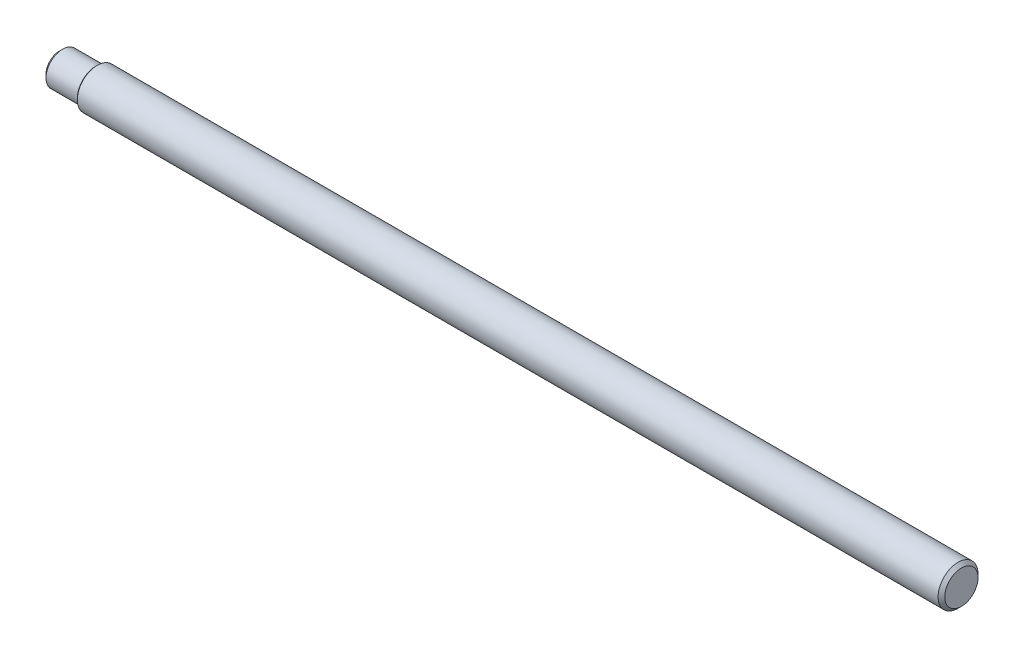
ISO-10303-21;
HEADER;
FILE_DESCRIPTION(('STEP AP214'),'2;1');
FILE_NAME('part.step','',(''),(''),'','','');
FILE_SCHEMA(('AUTOMOTIVE_DESIGN { 1 0 10303 214 1 1 1 1 }'));
ENDSEC;
DATA;
#1=APPLICATION_CONTEXT('core data for automotive mechanical design processes');
#2=APPLICATION_PROTOCOL_DEFINITION('international standard','automotive_design',2000,#1);
#3=PRODUCT_CONTEXT('',#1,'mechanical');
#4=PRODUCT('Part','Part','',(#3));
#5=PRODUCT_RELATED_PRODUCT_CATEGORY('part','',(#4));
#6=PRODUCT_DEFINITION_FORMATION('','',#4);
#7=PRODUCT_DEFINITION_CONTEXT('part definition',#1,'design');
#8=PRODUCT_DEFINITION('design','',#6,#7);
#9=PRODUCT_DEFINITION_SHAPE('','',#8);
#10=(LENGTH_UNIT() NAMED_UNIT(*) SI_UNIT(.MILLI.,.METRE.));
#11=(NAMED_UNIT(*) PLANE_ANGLE_UNIT() SI_UNIT($,.RADIAN.));
#12=(NAMED_UNIT(*) SI_UNIT($,.STERADIAN.) SOLID_ANGLE_UNIT());
#13=UNCERTAINTY_MEASURE_WITH_UNIT(LENGTH_MEASURE(1.E-05),#10,'distance_accuracy_value','');
#14=(GEOMETRIC_REPRESENTATION_CONTEXT(3) GLOBAL_UNCERTAINTY_ASSIGNED_CONTEXT((#13)) GLOBAL_UNIT_ASSIGNED_CONTEXT((#10,
#11,#12)) REPRESENTATION_CONTEXT('',''));
#15=CARTESIAN_POINT('',(0.,0.,0.));
#16=DIRECTION('',(0.,0.,1.));
#17=DIRECTION('',(1.,0.,0.));
#18=AXIS2_PLACEMENT_3D('',#15,#16,#17);
#19=CARTESIAN_POINT('',(130.,2.5,0.));
#20=DIRECTION('',(-1.,0.,0.));
#21=DIRECTION('',(0.,0.,1.));
#22=AXIS2_PLACEMENT_3D('',#19,#20,#21);
#23=PLANE('',#22);
#24=CARTESIAN_POINT('',(130.,0.,0.));
#25=DIRECTION('',(-1.,0.,0.));
#26=DIRECTION('',(0.,0.,1.));
#27=AXIS2_PLACEMENT_3D('',#24,#25,#26);
#28=CIRCLE('',#27,2.5);
#29=CARTESIAN_POINT('',(130.,0.,2.5));
#30=VERTEX_POINT('',#29);
#31=EDGE_CURVE('E10',#30,#30,#28,.T.);
#32=ORIENTED_EDGE('',*,*,#31,.F.);
#33=EDGE_LOOP('',(#32));
#34=FACE_BOUND('',#33,.T.);
#35=ADVANCED_FACE('F32',(#34),#23,.F.);
#36=CARTESIAN_POINT('',(130.,0.,0.));
#37=DIRECTION('',(-1.,0.,0.));
#38=DIRECTION('',(0.,0.,1.));
#39=AXIS2_PLACEMENT_3D('',#36,#37,#38);
#40=CONICAL_SURFACE('',#39,2.5,0.785398163397448);
#41=CARTESIAN_POINT('',(129.5,0.,0.));
#42=DIRECTION('',(-1.,0.,0.));
#43=DIRECTION('',(0.,0.,1.));
#44=AXIS2_PLACEMENT_3D('',#41,#42,#43);
#45=CIRCLE('',#44,3.);
#46=CARTESIAN_POINT('',(129.5,0.,3.));
#47=VERTEX_POINT('',#46);
#48=EDGE_CURVE('E38',#47,#47,#45,.T.);
#49=ORIENTED_EDGE('',*,*,#48,.F.);
#50=EDGE_LOOP('',(#49));
#51=FACE_BOUND('',#50,.T.);
#52=ORIENTED_EDGE('',*,*,#31,.T.);
#53=EDGE_LOOP('',(#52));
#54=FACE_BOUND('',#53,.T.);
#55=ADVANCED_FACE('F98',(#51,#54),#40,.T.);
#56=CARTESIAN_POINT('',(130.,0.,0.));
#57=DIRECTION('',(-1.,0.,0.));
#58=DIRECTION('',(0.,0.,1.));
#59=AXIS2_PLACEMENT_3D('',#56,#57,#58);
#60=CYLINDRICAL_SURFACE('',#59,3.);
#61=CARTESIAN_POINT('',(0.200000000000006,0.,0.));
#62=DIRECTION('',(-1.,0.,0.));
#63=DIRECTION('',(0.,0.,1.));
#64=AXIS2_PLACEMENT_3D('',#61,#62,#63);
#65=CIRCLE('',#64,3.);
#66=CARTESIAN_POINT('',(0.200000000000006,0.,3.));
#67=VERTEX_POINT('',#66);
#68=EDGE_CURVE('E42',#67,#67,#65,.T.);
#69=ORIENTED_EDGE('',*,*,#68,.F.);
#70=EDGE_LOOP('',(#69));
#71=FACE_BOUND('',#70,.T.);
#72=ORIENTED_EDGE('',*,*,#48,.T.);
#73=EDGE_LOOP('',(#72));
#74=FACE_BOUND('',#73,.T.);
#75=ADVANCED_FACE('F93',(#71,#74),#60,.T.);
#76=CARTESIAN_POINT('',(0.200000000000006,0.,0.));
#77=DIRECTION('',(1.,0.,0.));
#78=DIRECTION('',(0.,0.,-1.));
#79=AXIS2_PLACEMENT_3D('',#76,#77,#78);
#80=CONICAL_SURFACE('',#79,3.,0.785398163397434);
#81=CARTESIAN_POINT('',(0.,0.,0.));
#82=DIRECTION('',(-1.,0.,0.));
#83=DIRECTION('',(0.,0.,1.));
#84=AXIS2_PLACEMENT_3D('',#81,#82,#83);
#85=CIRCLE('',#84,2.8);
#86=CARTESIAN_POINT('',(0.,0.,2.8));
#87=VERTEX_POINT('',#86);
#88=EDGE_CURVE('E46',#87,#87,#85,.T.);
#89=ORIENTED_EDGE('',*,*,#88,.F.);
#90=EDGE_LOOP('',(#89));
#91=FACE_BOUND('',#90,.T.);
#92=ORIENTED_EDGE('',*,*,#68,.T.);
#93=EDGE_LOOP('',(#92));
#94=FACE_BOUND('',#93,.T.);
#95=ADVANCED_FACE('F87',(#91,#94),#80,.T.);
#96=CARTESIAN_POINT('',(0.,2.7,0.));
#97=DIRECTION('',(1.,0.,0.));
#98=DIRECTION('',(0.,0.,-1.));
#99=AXIS2_PLACEMENT_3D('',#96,#97,#98);
#100=PLANE('',#99);
#101=CARTESIAN_POINT('',(0.,0.,0.));
#102=DIRECTION('',(-1.,0.,0.));
#103=DIRECTION('',(0.,0.,1.));
#104=AXIS2_PLACEMENT_3D('',#101,#102,#103);
#105=CIRCLE('',#104,2.7);
#106=CARTESIAN_POINT('',(0.,0.,2.7));
#107=VERTEX_POINT('',#106);
#108=EDGE_CURVE('E51',#107,#107,#105,.T.);
#109=ORIENTED_EDGE('',*,*,#108,.F.);
#110=EDGE_LOOP('',(#109));
#111=FACE_BOUND('',#110,.T.);
#112=ORIENTED_EDGE('',*,*,#88,.T.);
#113=EDGE_LOOP('',(#112));
#114=FACE_BOUND('',#113,.T.);
#115=ADVANCED_FACE('F81',(#111,#114),#100,.F.);
#116=CARTESIAN_POINT('',(-0.200000000000017,0.,0.));
#117=DIRECTION('',(-1.,0.,0.));
#118=DIRECTION('',(0.,0.,1.));
#119=AXIS2_PLACEMENT_3D('',#116,#117,#118);
#120=TOROIDAL_SURFACE('',#119,2.70000000000002,0.200000000000017);
#121=CARTESIAN_POINT('',(-0.200000000000006,0.,0.));
#122=DIRECTION('',(-1.,0.,0.));
#123=DIRECTION('',(0.,0.,1.));
#124=AXIS2_PLACEMENT_3D('',#121,#122,#123);
#125=CIRCLE('',#124,2.5);
#126=CARTESIAN_POINT('',(-0.200000000000006,0.,2.5));
#127=VERTEX_POINT('',#126);
#128=EDGE_CURVE('E54',#127,#127,#125,.T.);
#129=ORIENTED_EDGE('',*,*,#128,.F.);
#130=EDGE_LOOP('',(#129));
#131=FACE_BOUND('',#130,.T.);
#132=ORIENTED_EDGE('',*,*,#108,.T.);
#133=EDGE_LOOP('',(#132));
#134=FACE_BOUND('',#133,.T.);
#135=ADVANCED_FACE('F75',(#131,#134),#120,.F.);
#136=CARTESIAN_POINT('',(130.,0.,0.));
#137=DIRECTION('',(-1.,0.,0.));
#138=DIRECTION('',(0.,0.,1.));
#139=AXIS2_PLACEMENT_3D('',#136,#137,#138);
#140=CYLINDRICAL_SURFACE('',#139,2.5);
#141=CARTESIAN_POINT('',(-5.,0.,0.));
#142=DIRECTION('',(-1.,0.,0.));
#143=DIRECTION('',(0.,0.,1.));
#144=AXIS2_PLACEMENT_3D('',#141,#142,#143);
#145=CIRCLE('',#144,2.5);
#146=CARTESIAN_POINT('',(-5.,0.,2.5));
#147=VERTEX_POINT('',#146);
#148=EDGE_CURVE('E57',#147,#147,#145,.T.);
#149=ORIENTED_EDGE('',*,*,#148,.F.);
#150=EDGE_LOOP('',(#149));
#151=FACE_BOUND('',#150,.T.);
#152=ORIENTED_EDGE('',*,*,#128,.T.);
#153=EDGE_LOOP('',(#152));
#154=FACE_BOUND('',#153,.T.);
#155=ADVANCED_FACE('F69',(#151,#154),#140,.T.);
#156=CARTESIAN_POINT('',(-5.,0.,0.));
#157=DIRECTION('',(1.,0.,0.));
#158=DIRECTION('',(0.,0.,-1.));
#159=AXIS2_PLACEMENT_3D('',#156,#157,#158);
#160=CONICAL_SURFACE('',#159,2.5,0.785398163397448);
#161=CARTESIAN_POINT('',(-5.50000000000001,0.,0.));
#162=DIRECTION('',(-1.,0.,0.));
#163=DIRECTION('',(0.,0.,1.));
#164=AXIS2_PLACEMENT_3D('',#161,#162,#163);
#165=CIRCLE('',#164,2.);
#166=CARTESIAN_POINT('',(-5.50000000000001,0.,2.));
#167=VERTEX_POINT('',#166);
#168=EDGE_CURVE('E60',#167,#167,#165,.T.);
#169=ORIENTED_EDGE('',*,*,#168,.F.);
#170=EDGE_LOOP('',(#169));
#171=FACE_BOUND('',#170,.T.);
#172=ORIENTED_EDGE('',*,*,#148,.T.);
#173=EDGE_LOOP('',(#172));
#174=FACE_BOUND('',#173,.T.);
#175=ADVANCED_FACE('F66',(#171,#174),#160,.T.);
#176=CARTESIAN_POINT('',(-5.5,0.,0.));
#177=DIRECTION('',(1.,0.,0.));
#178=DIRECTION('',(0.,0.,-1.));
#179=AXIS2_PLACEMENT_3D('',#176,#177,#178);
#180=PLANE('',#179);
#181=ORIENTED_EDGE('',*,*,#168,.T.);
#182=EDGE_LOOP('',(#181));
#183=FACE_BOUND('',#182,.T.);
#184=ADVANCED_FACE('F64',(#183),#180,.F.);
#185=CLOSED_SHELL('',(#35,#55,#75,#95,#115,#135,#155,#175,#184));
#186=MANIFOLD_SOLID_BREP('B2',#185);
#187=ADVANCED_BREP_SHAPE_REPRESENTATION('',(#18,#186),#14);
#188=SHAPE_DEFINITION_REPRESENTATION(#9,#187);
ENDSEC;
END-ISO-10303-21;
